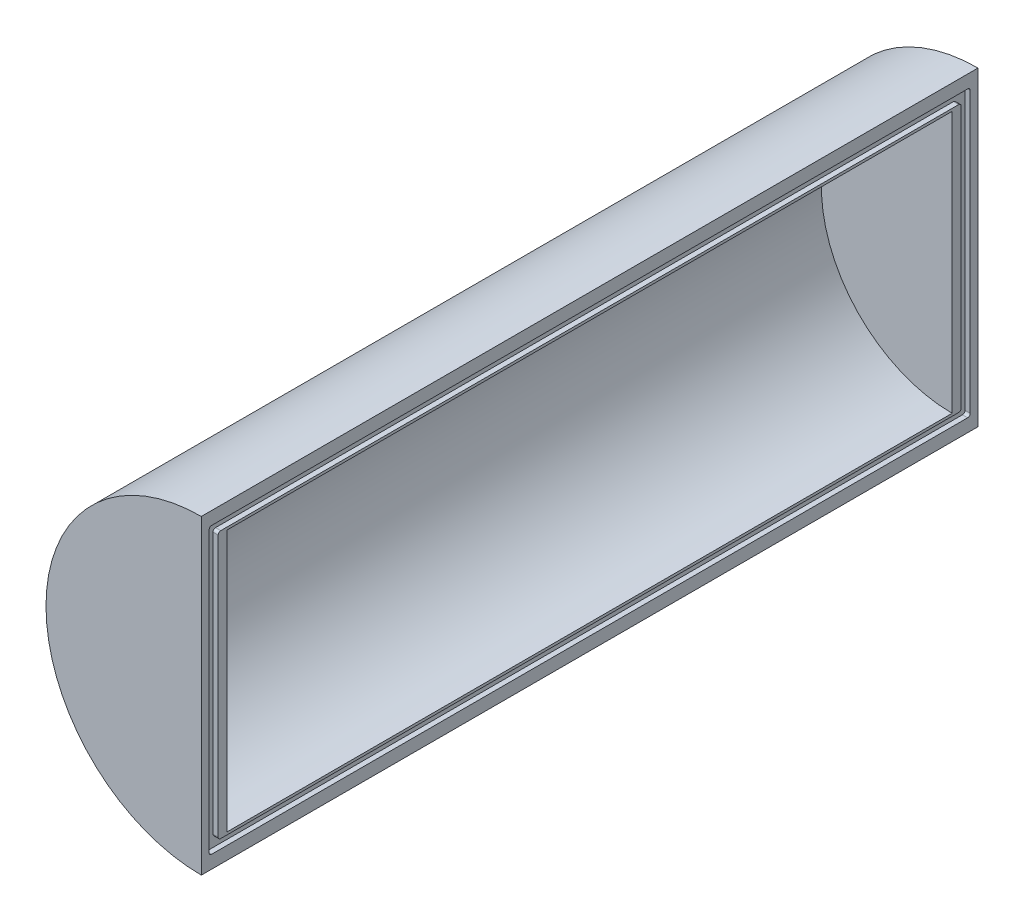
ISO-10303-21;
HEADER;
FILE_DESCRIPTION(('STEP AP214'),'2;1');
FILE_NAME('part.step','',(''),(''),'','','');
FILE_SCHEMA(('AUTOMOTIVE_DESIGN { 1 0 10303 214 1 1 1 1 }'));
ENDSEC;
DATA;
#1=APPLICATION_CONTEXT('core data for automotive mechanical design processes');
#2=APPLICATION_PROTOCOL_DEFINITION('international standard','automotive_design',2000,#1);
#3=PRODUCT_CONTEXT('',#1,'mechanical');
#4=PRODUCT('Part','Part','',(#3));
#5=PRODUCT_RELATED_PRODUCT_CATEGORY('part','',(#4));
#6=PRODUCT_DEFINITION_FORMATION('','',#4);
#7=PRODUCT_DEFINITION_CONTEXT('part definition',#1,'design');
#8=PRODUCT_DEFINITION('design','',#6,#7);
#9=PRODUCT_DEFINITION_SHAPE('','',#8);
#10=(LENGTH_UNIT() NAMED_UNIT(*) SI_UNIT(.MILLI.,.METRE.));
#11=(NAMED_UNIT(*) PLANE_ANGLE_UNIT() SI_UNIT($,.RADIAN.));
#12=(NAMED_UNIT(*) SI_UNIT($,.STERADIAN.) SOLID_ANGLE_UNIT());
#13=UNCERTAINTY_MEASURE_WITH_UNIT(LENGTH_MEASURE(1.E-05),#10,'distance_accuracy_value','');
#14=(GEOMETRIC_REPRESENTATION_CONTEXT(3) GLOBAL_UNCERTAINTY_ASSIGNED_CONTEXT((#13)) GLOBAL_UNIT_ASSIGNED_CONTEXT((#10,
#11,#12)) REPRESENTATION_CONTEXT('',''));
#15=CARTESIAN_POINT('',(0.,0.,0.));
#16=DIRECTION('',(0.,0.,1.));
#17=DIRECTION('',(1.,0.,0.));
#18=AXIS2_PLACEMENT_3D('',#15,#16,#17);
#19=CARTESIAN_POINT('',(0.,60.,-280.));
#20=DIRECTION('',(-1.,0.,0.));
#21=DIRECTION('',(0.,-1.,0.));
#22=AXIS2_PLACEMENT_3D('',#19,#20,#21);
#23=PLANE('',#22);
#24=DIRECTION('',(0.,1.,0.));
#25=VECTOR('',#24,1.);
#26=CARTESIAN_POINT('',(0.,60.,-290.));
#27=LINE('',#26,#25);
#28=CARTESIAN_POINT('',(0.,-60.,-290.));
#29=VERTEX_POINT('',#28);
#30=CARTESIAN_POINT('',(0.,60.,-290.));
#31=VERTEX_POINT('',#30);
#32=EDGE_CURVE('E302',#29,#31,#27,.T.);
#33=ORIENTED_EDGE('',*,*,#32,.T.);
#34=DIRECTION('',(0.,0.,1.));
#35=VECTOR('',#34,1.);
#36=CARTESIAN_POINT('',(0.,60.,-280.));
#37=LINE('',#36,#35);
#38=CARTESIAN_POINT('',(0.,60.,10.));
#39=VERTEX_POINT('',#38);
#40=EDGE_CURVE('E285',#31,#39,#37,.T.);
#41=ORIENTED_EDGE('',*,*,#40,.T.);
#42=DIRECTION('',(0.,1.,0.));
#43=VECTOR('',#42,1.);
#44=CARTESIAN_POINT('',(0.,60.,10.));
#45=LINE('',#44,#43);
#46=CARTESIAN_POINT('',(0.,-60.,10.));
#47=VERTEX_POINT('',#46);
#48=EDGE_CURVE('E321',#47,#39,#45,.T.);
#49=ORIENTED_EDGE('',*,*,#48,.F.);
#50=DIRECTION('',(0.,0.,1.));
#51=VECTOR('',#50,1.);
#52=CARTESIAN_POINT('',(0.,-60.,-280.));
#53=LINE('',#52,#51);
#54=EDGE_CURVE('E306',#29,#47,#53,.T.);
#55=ORIENTED_EDGE('',*,*,#54,.F.);
#56=EDGE_LOOP('',(#33,#41,#49,#55));
#57=FACE_BOUND('',#56,.T.);
#58=DIRECTION('',(0.,0.,1.));
#59=VECTOR('',#58,1.);
#60=CARTESIAN_POINT('',(0.,55.,-280.));
#61=LINE('',#60,#59);
#62=CARTESIAN_POINT('',(0.,55.,-286.));
#63=VERTEX_POINT('',#62);
#64=CARTESIAN_POINT('',(0.,55.,6.00000000000001));
#65=VERTEX_POINT('',#64);
#66=EDGE_CURVE('E298',#63,#65,#61,.T.);
#67=ORIENTED_EDGE('',*,*,#66,.F.);
#68=CARTESIAN_POINT('',(0.,54.,-286.));
#69=DIRECTION('',(-1.,0.,0.));
#70=DIRECTION('',(0.,-1.,0.));
#71=AXIS2_PLACEMENT_3D('',#68,#69,#70);
#72=CIRCLE('',#71,1.);
#73=CARTESIAN_POINT('',(0.,54.,-287.));
#74=VERTEX_POINT('',#73);
#75=EDGE_CURVE('E170',#63,#74,#72,.T.);
#76=ORIENTED_EDGE('',*,*,#75,.T.);
#77=DIRECTION('',(0.,1.,0.));
#78=VECTOR('',#77,1.);
#79=CARTESIAN_POINT('',(0.,51.5,-287.));
#80=LINE('',#79,#78);
#81=CARTESIAN_POINT('',(0.,-54.,-287.));
#82=VERTEX_POINT('',#81);
#83=EDGE_CURVE('E469',#74,#82,#80,.F.);
#84=ORIENTED_EDGE('',*,*,#83,.T.);
#85=CARTESIAN_POINT('',(0.,-54.,-286.));
#86=DIRECTION('',(-1.,0.,0.));
#87=DIRECTION('',(0.,-1.,0.));
#88=AXIS2_PLACEMENT_3D('',#85,#86,#87);
#89=CIRCLE('',#88,1.);
#90=CARTESIAN_POINT('',(0.,-55.,-286.));
#91=VERTEX_POINT('',#90);
#92=EDGE_CURVE('E156',#82,#91,#89,.T.);
#93=ORIENTED_EDGE('',*,*,#92,.T.);
#94=DIRECTION('',(0.,0.,1.));
#95=VECTOR('',#94,1.);
#96=CARTESIAN_POINT('',(0.,-55.,-280.));
#97=LINE('',#96,#95);
#98=CARTESIAN_POINT('',(0.,-55.,6.00000000000001));
#99=VERTEX_POINT('',#98);
#100=EDGE_CURVE('E367',#91,#99,#97,.T.);
#101=ORIENTED_EDGE('',*,*,#100,.T.);
#102=CARTESIAN_POINT('',(0.,-54.,6.00000000000001));
#103=DIRECTION('',(-1.,0.,0.));
#104=DIRECTION('',(0.,-1.,0.));
#105=AXIS2_PLACEMENT_3D('',#102,#103,#104);
#106=CIRCLE('',#105,1.);
#107=CARTESIAN_POINT('',(0.,-54.,7.));
#108=VERTEX_POINT('',#107);
#109=EDGE_CURVE('E451',#99,#108,#106,.T.);
#110=ORIENTED_EDGE('',*,*,#109,.T.);
#111=DIRECTION('',(0.,1.,0.));
#112=VECTOR('',#111,1.);
#113=CARTESIAN_POINT('',(0.,51.5,7.));
#114=LINE('',#113,#112);
#115=CARTESIAN_POINT('',(0.,54.,7.));
#116=VERTEX_POINT('',#115);
#117=EDGE_CURVE('E504',#116,#108,#114,.F.);
#118=ORIENTED_EDGE('',*,*,#117,.F.);
#119=CARTESIAN_POINT('',(0.,54.,6.));
#120=DIRECTION('',(-1.,0.,0.));
#121=DIRECTION('',(0.,-1.,0.));
#122=AXIS2_PLACEMENT_3D('',#119,#120,#121);
#123=CIRCLE('',#122,1.);
#124=EDGE_CURVE('E457',#116,#65,#123,.T.);
#125=ORIENTED_EDGE('',*,*,#124,.T.);
#126=EDGE_LOOP('',(#67,#76,#84,#93,#101,#110,#118,#125));
#127=FACE_BOUND('',#126,.T.);
#128=ADVANCED_FACE('F147',(#57,#127),#23,.F.);
#129=CARTESIAN_POINT('',(0.,0.,-280.));
#130=DIRECTION('',(0.,0.,1.));
#131=DIRECTION('',(1.,0.,0.));
#132=AXIS2_PLACEMENT_3D('',#129,#130,#131);
#133=CYLINDRICAL_SURFACE('',#132,60.);
#134=ORIENTED_EDGE('',*,*,#54,.T.);
#135=CARTESIAN_POINT('',(0.,0.,10.));
#136=DIRECTION('',(0.,0.,1.));
#137=DIRECTION('',(1.,0.,0.));
#138=AXIS2_PLACEMENT_3D('',#135,#136,#137);
#139=CIRCLE('',#138,60.);
#140=EDGE_CURVE('E291',#39,#47,#139,.T.);
#141=ORIENTED_EDGE('',*,*,#140,.F.);
#142=ORIENTED_EDGE('',*,*,#40,.F.);
#143=CARTESIAN_POINT('',(0.,0.,-290.));
#144=DIRECTION('',(0.,0.,1.));
#145=DIRECTION('',(1.,0.,0.));
#146=AXIS2_PLACEMENT_3D('',#143,#144,#145);
#147=CIRCLE('',#146,60.);
#148=EDGE_CURVE('E288',#31,#29,#147,.T.);
#149=ORIENTED_EDGE('',*,*,#148,.T.);
#150=EDGE_LOOP('',(#134,#141,#142,#149));
#151=FACE_BOUND('',#150,.T.);
#152=ADVANCED_FACE('F287',(#151),#133,.T.);
#153=DIRECTION('',(0.,-1.,0.));
#154=VECTOR('',#153,1.);
#155=CARTESIAN_POINT('',(0.,51.5,3.5));
#156=LINE('',#155,#154);
#157=CARTESIAN_POINT('',(0.,50.5,3.5));
#158=VERTEX_POINT('',#157);
#159=CARTESIAN_POINT('',(0.,-50.5,3.5));
#160=VERTEX_POINT('',#159);
#161=EDGE_CURVE('E493',#158,#160,#156,.T.);
#162=ORIENTED_EDGE('',*,*,#161,.T.);
#163=CARTESIAN_POINT('',(0.,-50.5,2.5));
#164=DIRECTION('',(-1.,0.,0.));
#165=DIRECTION('',(0.,-1.,0.));
#166=AXIS2_PLACEMENT_3D('',#163,#164,#165);
#167=CIRCLE('',#166,1.);
#168=CARTESIAN_POINT('',(0.,-51.5,2.5));
#169=VERTEX_POINT('',#168);
#170=EDGE_CURVE('E414',#160,#169,#167,.F.);
#171=ORIENTED_EDGE('',*,*,#170,.T.);
#172=DIRECTION('',(0.,0.,1.));
#173=VECTOR('',#172,1.);
#174=CARTESIAN_POINT('',(0.,-51.5,-280.));
#175=LINE('',#174,#173);
#176=CARTESIAN_POINT('',(0.,-51.5,-282.5));
#177=VERTEX_POINT('',#176);
#178=EDGE_CURVE('E355',#177,#169,#175,.T.);
#179=ORIENTED_EDGE('',*,*,#178,.F.);
#180=CARTESIAN_POINT('',(0.,-50.5,-282.5));
#181=DIRECTION('',(-1.,0.,0.));
#182=DIRECTION('',(0.,-1.,0.));
#183=AXIS2_PLACEMENT_3D('',#180,#181,#182);
#184=CIRCLE('',#183,1.);
#185=CARTESIAN_POINT('',(0.,-50.5,-283.5));
#186=VERTEX_POINT('',#185);
#187=EDGE_CURVE('E405',#177,#186,#184,.F.);
#188=ORIENTED_EDGE('',*,*,#187,.T.);
#189=DIRECTION('',(0.,-1.,0.));
#190=VECTOR('',#189,1.);
#191=CARTESIAN_POINT('',(0.,51.5,-283.5));
#192=LINE('',#191,#190);
#193=CARTESIAN_POINT('',(0.,50.5,-283.5));
#194=VERTEX_POINT('',#193);
#195=EDGE_CURVE('E488',#194,#186,#192,.T.);
#196=ORIENTED_EDGE('',*,*,#195,.F.);
#197=CARTESIAN_POINT('',(0.,50.5,-282.5));
#198=DIRECTION('',(-1.,0.,0.));
#199=DIRECTION('',(0.,-1.,0.));
#200=AXIS2_PLACEMENT_3D('',#197,#198,#199);
#201=CIRCLE('',#200,1.);
#202=CARTESIAN_POINT('',(0.,51.5,-282.5));
#203=VERTEX_POINT('',#202);
#204=EDGE_CURVE('E408',#194,#203,#201,.F.);
#205=ORIENTED_EDGE('',*,*,#204,.T.);
#206=DIRECTION('',(0.,0.,1.));
#207=VECTOR('',#206,1.);
#208=CARTESIAN_POINT('',(0.,51.5,-280.));
#209=LINE('',#208,#207);
#210=CARTESIAN_POINT('',(0.,51.5,2.5));
#211=VERTEX_POINT('',#210);
#212=EDGE_CURVE('E343',#203,#211,#209,.T.);
#213=ORIENTED_EDGE('',*,*,#212,.T.);
#214=CARTESIAN_POINT('',(0.,50.5,2.5));
#215=DIRECTION('',(-1.,0.,0.));
#216=DIRECTION('',(0.,-1.,0.));
#217=AXIS2_PLACEMENT_3D('',#214,#215,#216);
#218=CIRCLE('',#217,1.);
#219=EDGE_CURVE('E411',#211,#158,#218,.F.);
#220=ORIENTED_EDGE('',*,*,#219,.T.);
#221=EDGE_LOOP('',(#162,#171,#179,#188,#196,#205,#213,#220));
#222=FACE_BOUND('',#221,.T.);
#223=DIRECTION('',(0.,0.,1.));
#224=VECTOR('',#223,1.);
#225=CARTESIAN_POINT('',(0.,50.5,-280.));
#226=LINE('',#225,#224);
#227=CARTESIAN_POINT('',(0.,50.5,-280.));
#228=VERTEX_POINT('',#227);
#229=CARTESIAN_POINT('',(0.,50.5,0.));
#230=VERTEX_POINT('',#229);
#231=EDGE_CURVE('E347',#228,#230,#226,.T.);
#232=ORIENTED_EDGE('',*,*,#231,.F.);
#233=DIRECTION('',(0.,1.,0.));
#234=VECTOR('',#233,1.);
#235=CARTESIAN_POINT('',(0.,60.,-280.));
#236=LINE('',#235,#234);
#237=CARTESIAN_POINT('',(0.,-50.5,-280.));
#238=VERTEX_POINT('',#237);
#239=EDGE_CURVE('E304',#238,#228,#236,.T.);
#240=ORIENTED_EDGE('',*,*,#239,.F.);
#241=DIRECTION('',(0.,0.,1.));
#242=VECTOR('',#241,1.);
#243=CARTESIAN_POINT('',(0.,-50.5,-280.));
#244=LINE('',#243,#242);
#245=CARTESIAN_POINT('',(0.,-50.5,0.));
#246=VERTEX_POINT('',#245);
#247=EDGE_CURVE('E351',#238,#246,#244,.T.);
#248=ORIENTED_EDGE('',*,*,#247,.T.);
#249=DIRECTION('',(0.,1.,0.));
#250=VECTOR('',#249,1.);
#251=CARTESIAN_POINT('',(0.,60.,0.));
#252=LINE('',#251,#250);
#253=EDGE_CURVE('E308',#246,#230,#252,.T.);
#254=ORIENTED_EDGE('',*,*,#253,.T.);
#255=EDGE_LOOP('',(#232,#240,#248,#254));
#256=FACE_BOUND('',#255,.T.);
#257=ADVANCED_FACE('F542',(#222,#256),#23,.F.);
#258=CARTESIAN_POINT('',(0.,55.,-280.));
#259=DIRECTION('',(0.,1.,0.));
#260=DIRECTION('',(0.,0.,1.));
#261=AXIS2_PLACEMENT_3D('',#258,#259,#260);
#262=PLANE('',#261);
#263=ORIENTED_EDGE('',*,*,#66,.T.);
#264=DIRECTION('',(1.,0.,0.));
#265=VECTOR('',#264,1.);
#266=CARTESIAN_POINT('',(-2.,55.,6.));
#267=LINE('',#266,#265);
#268=CARTESIAN_POINT('',(-2.,55.,6.00000000000001));
#269=VERTEX_POINT('',#268);
#270=EDGE_CURVE('E428',#65,#269,#267,.F.);
#271=ORIENTED_EDGE('',*,*,#270,.T.);
#272=DIRECTION('',(0.,0.,1.));
#273=VECTOR('',#272,1.);
#274=CARTESIAN_POINT('',(-2.,55.,-280.));
#275=LINE('',#274,#273);
#276=CARTESIAN_POINT('',(-2.,55.,-286.));
#277=VERTEX_POINT('',#276);
#278=EDGE_CURVE('E335',#277,#269,#275,.T.);
#279=ORIENTED_EDGE('',*,*,#278,.F.);
#280=DIRECTION('',(1.,0.,0.));
#281=VECTOR('',#280,1.);
#282=CARTESIAN_POINT('',(0.,55.,-286.));
#283=LINE('',#282,#281);
#284=EDGE_CURVE('E424',#277,#63,#283,.T.);
#285=ORIENTED_EDGE('',*,*,#284,.T.);
#286=EDGE_LOOP('',(#263,#271,#279,#285));
#287=FACE_BOUND('',#286,.T.);
#288=ADVANCED_FACE('F525',(#287),#262,.F.);
#289=CARTESIAN_POINT('',(-2.,55.,-280.));
#290=DIRECTION('',(-1.,0.,0.));
#291=DIRECTION('',(0.,-1.,0.));
#292=AXIS2_PLACEMENT_3D('',#289,#290,#291);
#293=PLANE('',#292);
#294=DIRECTION('',(0.,0.,1.));
#295=VECTOR('',#294,1.);
#296=CARTESIAN_POINT('',(-2.,51.5,-280.));
#297=LINE('',#296,#295);
#298=CARTESIAN_POINT('',(-2.,51.5,-282.5));
#299=VERTEX_POINT('',#298);
#300=CARTESIAN_POINT('',(-2.,51.5,2.5));
#301=VERTEX_POINT('',#300);
#302=EDGE_CURVE('E339',#299,#301,#297,.T.);
#303=ORIENTED_EDGE('',*,*,#302,.F.);
#304=CARTESIAN_POINT('',(-2.,50.5,-282.5));
#305=DIRECTION('',(-1.,0.,0.));
#306=DIRECTION('',(0.,-1.,0.));
#307=AXIS2_PLACEMENT_3D('',#304,#305,#306);
#308=CIRCLE('',#307,1.);
#309=CARTESIAN_POINT('',(-2.,50.5,-283.5));
#310=VERTEX_POINT('',#309);
#311=EDGE_CURVE('E463',#299,#310,#308,.T.);
#312=ORIENTED_EDGE('',*,*,#311,.T.);
#313=DIRECTION('',(0.,-1.,0.));
#314=VECTOR('',#313,1.);
#315=CARTESIAN_POINT('',(-2.,51.5,-283.5));
#316=LINE('',#315,#314);
#317=CARTESIAN_POINT('',(-2.,-50.5,-283.5));
#318=VERTEX_POINT('',#317);
#319=EDGE_CURVE('E487',#310,#318,#316,.T.);
#320=ORIENTED_EDGE('',*,*,#319,.T.);
#321=CARTESIAN_POINT('',(-1.99999999999999,-50.5,-282.5));
#322=DIRECTION('',(-1.,0.,0.));
#323=DIRECTION('',(0.,-1.,0.));
#324=AXIS2_PLACEMENT_3D('',#321,#322,#323);
#325=CIRCLE('',#324,1.);
#326=CARTESIAN_POINT('',(-2.,-51.5,-282.5));
#327=VERTEX_POINT('',#326);
#328=EDGE_CURVE('E12',#318,#327,#325,.T.);
#329=ORIENTED_EDGE('',*,*,#328,.T.);
#330=DIRECTION('',(0.,0.,1.));
#331=VECTOR('',#330,1.);
#332=CARTESIAN_POINT('',(-2.,-51.5,-280.));
#333=LINE('',#332,#331);
#334=CARTESIAN_POINT('',(-2.,-51.5,2.5));
#335=VERTEX_POINT('',#334);
#336=EDGE_CURVE('E359',#327,#335,#333,.T.);
#337=ORIENTED_EDGE('',*,*,#336,.T.);
#338=CARTESIAN_POINT('',(-1.99999999999999,-50.5,2.5));
#339=DIRECTION('',(-1.,0.,0.));
#340=DIRECTION('',(0.,-1.,0.));
#341=AXIS2_PLACEMENT_3D('',#338,#339,#340);
#342=CIRCLE('',#341,1.);
#343=CARTESIAN_POINT('',(-2.,-50.5,3.5));
#344=VERTEX_POINT('',#343);
#345=EDGE_CURVE('E454',#335,#344,#342,.T.);
#346=ORIENTED_EDGE('',*,*,#345,.T.);
#347=DIRECTION('',(0.,-1.,0.));
#348=VECTOR('',#347,1.);
#349=CARTESIAN_POINT('',(-2.,51.5,3.5));
#350=LINE('',#349,#348);
#351=CARTESIAN_POINT('',(-2.,50.5,3.5));
#352=VERTEX_POINT('',#351);
#353=EDGE_CURVE('E500',#352,#344,#350,.T.);
#354=ORIENTED_EDGE('',*,*,#353,.F.);
#355=CARTESIAN_POINT('',(-2.,50.5,2.5));
#356=DIRECTION('',(-1.,0.,0.));
#357=DIRECTION('',(0.,-1.,0.));
#358=AXIS2_PLACEMENT_3D('',#355,#356,#357);
#359=CIRCLE('',#358,1.);
#360=EDGE_CURVE('E460',#352,#301,#359,.T.);
#361=ORIENTED_EDGE('',*,*,#360,.T.);
#362=EDGE_LOOP('',(#303,#312,#320,#329,#337,#346,#354,#361));
#363=FACE_BOUND('',#362,.T.);
#364=DIRECTION('',(0.,1.,0.));
#365=VECTOR('',#364,1.);
#366=CARTESIAN_POINT('',(-2.,51.5,7.));
#367=LINE('',#366,#365);
#368=CARTESIAN_POINT('',(-2.,54.,7.));
#369=VERTEX_POINT('',#368);
#370=CARTESIAN_POINT('',(-2.,-54.,7.));
#371=VERTEX_POINT('',#370);
#372=EDGE_CURVE('E318',#369,#371,#367,.F.);
#373=ORIENTED_EDGE('',*,*,#372,.T.);
#374=CARTESIAN_POINT('',(-1.99999999999999,-54.,6.00000000000001));
#375=DIRECTION('',(-1.,0.,0.));
#376=DIRECTION('',(0.,-1.,0.));
#377=AXIS2_PLACEMENT_3D('',#374,#375,#376);
#378=CIRCLE('',#377,1.);
#379=CARTESIAN_POINT('',(-2.,-55.,6.00000000000001));
#380=VERTEX_POINT('',#379);
#381=EDGE_CURVE('E395',#371,#380,#378,.F.);
#382=ORIENTED_EDGE('',*,*,#381,.T.);
#383=DIRECTION('',(0.,0.,1.));
#384=VECTOR('',#383,1.);
#385=CARTESIAN_POINT('',(-2.,-55.,-280.));
#386=LINE('',#385,#384);
#387=CARTESIAN_POINT('',(-2.,-55.,-286.));
#388=VERTEX_POINT('',#387);
#389=EDGE_CURVE('E363',#388,#380,#386,.T.);
#390=ORIENTED_EDGE('',*,*,#389,.F.);
#391=CARTESIAN_POINT('',(-1.99999999999999,-54.,-286.));
#392=DIRECTION('',(-1.,0.,0.));
#393=DIRECTION('',(0.,-1.,0.));
#394=AXIS2_PLACEMENT_3D('',#391,#392,#393);
#395=CIRCLE('',#394,1.);
#396=CARTESIAN_POINT('',(-2.,-54.,-287.));
#397=VERTEX_POINT('',#396);
#398=EDGE_CURVE('E386',#388,#397,#395,.F.);
#399=ORIENTED_EDGE('',*,*,#398,.T.);
#400=DIRECTION('',(0.,1.,0.));
#401=VECTOR('',#400,1.);
#402=CARTESIAN_POINT('',(-2.,51.5,-287.));
#403=LINE('',#402,#401);
#404=CARTESIAN_POINT('',(-2.,54.,-287.));
#405=VERTEX_POINT('',#404);
#406=EDGE_CURVE('E481',#405,#397,#403,.F.);
#407=ORIENTED_EDGE('',*,*,#406,.F.);
#408=CARTESIAN_POINT('',(-2.,54.,-286.));
#409=DIRECTION('',(-1.,0.,0.));
#410=DIRECTION('',(0.,-1.,0.));
#411=AXIS2_PLACEMENT_3D('',#408,#409,#410);
#412=CIRCLE('',#411,1.);
#413=EDGE_CURVE('E389',#405,#277,#412,.F.);
#414=ORIENTED_EDGE('',*,*,#413,.T.);
#415=ORIENTED_EDGE('',*,*,#278,.T.);
#416=CARTESIAN_POINT('',(-2.,54.,6.));
#417=DIRECTION('',(-1.,0.,0.));
#418=DIRECTION('',(0.,-1.,0.));
#419=AXIS2_PLACEMENT_3D('',#416,#417,#418);
#420=CIRCLE('',#419,1.);
#421=EDGE_CURVE('E392',#269,#369,#420,.F.);
#422=ORIENTED_EDGE('',*,*,#421,.T.);
#423=EDGE_LOOP('',(#373,#382,#390,#399,#407,#414,#415,#422));
#424=FACE_BOUND('',#423,.T.);
#425=ADVANCED_FACE('F480',(#363,#424),#293,.F.);
#426=CARTESIAN_POINT('',(-2.,51.5,-280.));
#427=DIRECTION('',(0.,-1.,0.));
#428=DIRECTION('',(0.,0.,-1.));
#429=AXIS2_PLACEMENT_3D('',#426,#427,#428);
#430=PLANE('',#429);
#431=ORIENTED_EDGE('',*,*,#302,.T.);
#432=DIRECTION('',(1.,0.,0.));
#433=VECTOR('',#432,1.);
#434=CARTESIAN_POINT('',(0.,51.5,2.5));
#435=LINE('',#434,#433);
#436=EDGE_CURVE('E434',#301,#211,#435,.T.);
#437=ORIENTED_EDGE('',*,*,#436,.T.);
#438=ORIENTED_EDGE('',*,*,#212,.F.);
#439=DIRECTION('',(1.,0.,0.));
#440=VECTOR('',#439,1.);
#441=CARTESIAN_POINT('',(-2.,51.5,-282.5));
#442=LINE('',#441,#440);
#443=EDGE_CURVE('E431',#203,#299,#442,.F.);
#444=ORIENTED_EDGE('',*,*,#443,.T.);
#445=EDGE_LOOP('',(#431,#437,#438,#444));
#446=FACE_BOUND('',#445,.T.);
#447=ADVANCED_FACE('F608',(#446),#430,.F.);
#448=CARTESIAN_POINT('',(0.,0.,-280.));
#449=DIRECTION('',(0.,0.,1.));
#450=DIRECTION('',(1.,0.,0.));
#451=AXIS2_PLACEMENT_3D('',#448,#449,#450);
#452=CYLINDRICAL_SURFACE('',#451,50.5);
#453=CARTESIAN_POINT('',(0.,0.,0.));
#454=DIRECTION('',(0.,0.,1.));
#455=DIRECTION('',(1.,0.,0.));
#456=AXIS2_PLACEMENT_3D('',#453,#454,#455);
#457=CIRCLE('',#456,50.5);
#458=EDGE_CURVE('E323',#230,#246,#457,.T.);
#459=ORIENTED_EDGE('',*,*,#458,.T.);
#460=ORIENTED_EDGE('',*,*,#247,.F.);
#461=CARTESIAN_POINT('',(0.,0.,-280.));
#462=DIRECTION('',(0.,0.,1.));
#463=DIRECTION('',(1.,0.,0.));
#464=AXIS2_PLACEMENT_3D('',#461,#462,#463);
#465=CIRCLE('',#464,50.5);
#466=EDGE_CURVE('E325',#228,#238,#465,.T.);
#467=ORIENTED_EDGE('',*,*,#466,.F.);
#468=ORIENTED_EDGE('',*,*,#231,.T.);
#469=EDGE_LOOP('',(#459,#460,#467,#468));
#470=FACE_BOUND('',#469,.T.);
#471=ADVANCED_FACE('F559',(#470),#452,.F.);
#472=CARTESIAN_POINT('',(0.,-51.5,-280.));
#473=DIRECTION('',(0.,1.,0.));
#474=DIRECTION('',(0.,0.,1.));
#475=AXIS2_PLACEMENT_3D('',#472,#473,#474);
#476=PLANE('',#475);
#477=ORIENTED_EDGE('',*,*,#178,.T.);
#478=DIRECTION('',(1.,0.,0.));
#479=VECTOR('',#478,1.);
#480=CARTESIAN_POINT('',(-2.,-51.5,2.5));
#481=LINE('',#480,#479);
#482=EDGE_CURVE('E421',#169,#335,#481,.F.);
#483=ORIENTED_EDGE('',*,*,#482,.T.);
#484=ORIENTED_EDGE('',*,*,#336,.F.);
#485=DIRECTION('',(1.,0.,0.));
#486=VECTOR('',#485,1.);
#487=CARTESIAN_POINT('',(0.,-51.5,-282.5));
#488=LINE('',#487,#486);
#489=EDGE_CURVE('E417',#327,#177,#488,.T.);
#490=ORIENTED_EDGE('',*,*,#489,.T.);
#491=EDGE_LOOP('',(#477,#483,#484,#490));
#492=FACE_BOUND('',#491,.T.);
#493=ADVANCED_FACE('F579',(#492),#476,.F.);
#494=CARTESIAN_POINT('',(-2.,-55.,-280.));
#495=DIRECTION('',(0.,-1.,0.));
#496=DIRECTION('',(0.,0.,-1.));
#497=AXIS2_PLACEMENT_3D('',#494,#495,#496);
#498=PLANE('',#497);
#499=ORIENTED_EDGE('',*,*,#389,.T.);
#500=DIRECTION('',(1.,0.,0.));
#501=VECTOR('',#500,1.);
#502=CARTESIAN_POINT('',(0.,-55.,6.00000000000001));
#503=LINE('',#502,#501);
#504=EDGE_CURVE('E375',#380,#99,#503,.T.);
#505=ORIENTED_EDGE('',*,*,#504,.T.);
#506=ORIENTED_EDGE('',*,*,#100,.F.);
#507=DIRECTION('',(1.,0.,0.));
#508=VECTOR('',#507,1.);
#509=CARTESIAN_POINT('',(-2.,-55.,-286.));
#510=LINE('',#509,#508);
#511=EDGE_CURVE('E297',#91,#388,#510,.F.);
#512=ORIENTED_EDGE('',*,*,#511,.T.);
#513=EDGE_LOOP('',(#499,#505,#506,#512));
#514=FACE_BOUND('',#513,.T.);
#515=ADVANCED_FACE('F471',(#514),#498,.F.);
#516=CARTESIAN_POINT('',(0.,0.,0.));
#517=DIRECTION('',(0.,0.,1.));
#518=DIRECTION('',(1.,0.,0.));
#519=AXIS2_PLACEMENT_3D('',#516,#517,#518);
#520=PLANE('',#519);
#521=ORIENTED_EDGE('',*,*,#458,.F.);
#522=ORIENTED_EDGE('',*,*,#253,.F.);
#523=EDGE_LOOP('',(#521,#522));
#524=FACE_BOUND('',#523,.T.);
#525=ADVANCED_FACE('F570',(#524),#520,.F.);
#526=CARTESIAN_POINT('',(0.,0.,10.));
#527=DIRECTION('',(0.,0.,1.));
#528=DIRECTION('',(1.,0.,0.));
#529=AXIS2_PLACEMENT_3D('',#526,#527,#528);
#530=PLANE('',#529);
#531=ORIENTED_EDGE('',*,*,#140,.T.);
#532=ORIENTED_EDGE('',*,*,#48,.T.);
#533=EDGE_LOOP('',(#531,#532));
#534=FACE_BOUND('',#533,.T.);
#535=ADVANCED_FACE('F563',(#534),#530,.T.);
#536=CARTESIAN_POINT('',(0.,0.,-280.));
#537=DIRECTION('',(0.,0.,-1.));
#538=DIRECTION('',(1.,0.,0.));
#539=AXIS2_PLACEMENT_3D('',#536,#537,#538);
#540=PLANE('',#539);
#541=ORIENTED_EDGE('',*,*,#239,.T.);
#542=ORIENTED_EDGE('',*,*,#466,.T.);
#543=EDGE_LOOP('',(#541,#542));
#544=FACE_BOUND('',#543,.T.);
#545=ADVANCED_FACE('F561',(#544),#540,.F.);
#546=CARTESIAN_POINT('',(0.,0.,-290.));
#547=DIRECTION('',(0.,0.,-1.));
#548=DIRECTION('',(1.,0.,0.));
#549=AXIS2_PLACEMENT_3D('',#546,#547,#548);
#550=PLANE('',#549);
#551=ORIENTED_EDGE('',*,*,#148,.F.);
#552=ORIENTED_EDGE('',*,*,#32,.F.);
#553=EDGE_LOOP('',(#551,#552));
#554=FACE_BOUND('',#553,.T.);
#555=ADVANCED_FACE('F301',(#554),#550,.T.);
#556=CARTESIAN_POINT('',(-2.,51.5,7.));
#557=DIRECTION('',(0.,0.,1.));
#558=DIRECTION('',(1.,0.,0.));
#559=AXIS2_PLACEMENT_3D('',#556,#557,#558);
#560=PLANE('',#559);
#561=ORIENTED_EDGE('',*,*,#117,.T.);
#562=DIRECTION('',(1.,0.,0.));
#563=VECTOR('',#562,1.);
#564=CARTESIAN_POINT('',(-2.,-54.,7.));
#565=LINE('',#564,#563);
#566=EDGE_CURVE('E383',#108,#371,#565,.F.);
#567=ORIENTED_EDGE('',*,*,#566,.T.);
#568=ORIENTED_EDGE('',*,*,#372,.F.);
#569=DIRECTION('',(1.,0.,0.));
#570=VECTOR('',#569,1.);
#571=CARTESIAN_POINT('',(0.,54.,7.));
#572=LINE('',#571,#570);
#573=EDGE_CURVE('E379',#369,#116,#572,.T.);
#574=ORIENTED_EDGE('',*,*,#573,.T.);
#575=EDGE_LOOP('',(#561,#567,#568,#574));
#576=FACE_BOUND('',#575,.T.);
#577=ADVANCED_FACE('F514',(#576),#560,.F.);
#578=CARTESIAN_POINT('',(-2.,51.5,3.5));
#579=DIRECTION('',(0.,0.,1.));
#580=DIRECTION('',(1.,0.,0.));
#581=AXIS2_PLACEMENT_3D('',#578,#579,#580);
#582=PLANE('',#581);
#583=ORIENTED_EDGE('',*,*,#353,.T.);
#584=DIRECTION('',(1.,0.,0.));
#585=VECTOR('',#584,1.);
#586=CARTESIAN_POINT('',(0.,-50.5,3.5));
#587=LINE('',#586,#585);
#588=EDGE_CURVE('E401',#344,#160,#587,.T.);
#589=ORIENTED_EDGE('',*,*,#588,.T.);
#590=ORIENTED_EDGE('',*,*,#161,.F.);
#591=DIRECTION('',(1.,0.,0.));
#592=VECTOR('',#591,1.);
#593=CARTESIAN_POINT('',(-2.,50.5,3.5));
#594=LINE('',#593,#592);
#595=EDGE_CURVE('E398',#158,#352,#594,.F.);
#596=ORIENTED_EDGE('',*,*,#595,.T.);
#597=EDGE_LOOP('',(#583,#589,#590,#596));
#598=FACE_BOUND('',#597,.T.);
#599=ADVANCED_FACE('F626',(#598),#582,.T.);
#600=CARTESIAN_POINT('',(-2.,51.5,-283.5));
#601=DIRECTION('',(0.,0.,1.));
#602=DIRECTION('',(1.,0.,0.));
#603=AXIS2_PLACEMENT_3D('',#600,#601,#602);
#604=PLANE('',#603);
#605=ORIENTED_EDGE('',*,*,#319,.F.);
#606=DIRECTION('',(1.,0.,0.));
#607=VECTOR('',#606,1.);
#608=CARTESIAN_POINT('',(-2.,50.5,-283.5));
#609=LINE('',#608,#607);
#610=EDGE_CURVE('E441',#310,#194,#609,.T.);
#611=ORIENTED_EDGE('',*,*,#610,.T.);
#612=ORIENTED_EDGE('',*,*,#195,.T.);
#613=DIRECTION('',(1.,0.,0.));
#614=VECTOR('',#613,1.);
#615=CARTESIAN_POINT('',(-2.,-50.5,-283.5));
#616=LINE('',#615,#614);
#617=EDGE_CURVE('E438',#186,#318,#616,.F.);
#618=ORIENTED_EDGE('',*,*,#617,.T.);
#619=EDGE_LOOP('',(#605,#611,#612,#618));
#620=FACE_BOUND('',#619,.T.);
#621=ADVANCED_FACE('F615',(#620),#604,.F.);
#622=CARTESIAN_POINT('',(-2.,51.5,-287.));
#623=DIRECTION('',(0.,0.,1.));
#624=DIRECTION('',(1.,0.,0.));
#625=AXIS2_PLACEMENT_3D('',#622,#623,#624);
#626=PLANE('',#625);
#627=ORIENTED_EDGE('',*,*,#83,.F.);
#628=DIRECTION('',(1.,0.,0.));
#629=VECTOR('',#628,1.);
#630=CARTESIAN_POINT('',(-2.,54.,-287.));
#631=LINE('',#630,#629);
#632=EDGE_CURVE('E448',#74,#405,#631,.F.);
#633=ORIENTED_EDGE('',*,*,#632,.T.);
#634=ORIENTED_EDGE('',*,*,#406,.T.);
#635=DIRECTION('',(1.,0.,0.));
#636=VECTOR('',#635,1.);
#637=CARTESIAN_POINT('',(-2.,-54.,-287.));
#638=LINE('',#637,#636);
#639=EDGE_CURVE('E445',#397,#82,#638,.T.);
#640=ORIENTED_EDGE('',*,*,#639,.T.);
#641=EDGE_LOOP('',(#627,#633,#634,#640));
#642=FACE_BOUND('',#641,.T.);
#643=ADVANCED_FACE('F484',(#642),#626,.T.);
#644=CARTESIAN_POINT('',(-2.,-54.,6.00000000000001));
#645=DIRECTION('',(-1.,0.,0.));
#646=DIRECTION('',(0.,0.,1.));
#647=AXIS2_PLACEMENT_3D('',#644,#645,#646);
#648=CYLINDRICAL_SURFACE('',#647,1.);
#649=ORIENTED_EDGE('',*,*,#381,.F.);
#650=ORIENTED_EDGE('',*,*,#566,.F.);
#651=ORIENTED_EDGE('',*,*,#109,.F.);
#652=ORIENTED_EDGE('',*,*,#504,.F.);
#653=EDGE_LOOP('',(#649,#650,#651,#652));
#654=FACE_BOUND('',#653,.T.);
#655=ADVANCED_FACE('F519',(#654),#648,.F.);
#656=CARTESIAN_POINT('',(-2.,-50.5,2.5));
#657=DIRECTION('',(-1.,0.,0.));
#658=DIRECTION('',(0.,0.,1.));
#659=AXIS2_PLACEMENT_3D('',#656,#657,#658);
#660=CYLINDRICAL_SURFACE('',#659,1.);
#661=ORIENTED_EDGE('',*,*,#345,.F.);
#662=ORIENTED_EDGE('',*,*,#482,.F.);
#663=ORIENTED_EDGE('',*,*,#170,.F.);
#664=ORIENTED_EDGE('',*,*,#588,.F.);
#665=EDGE_LOOP('',(#661,#662,#663,#664));
#666=FACE_BOUND('',#665,.T.);
#667=ADVANCED_FACE('F590',(#666),#660,.T.);
#668=CARTESIAN_POINT('',(-2.,54.,6.));
#669=DIRECTION('',(-1.,0.,0.));
#670=DIRECTION('',(0.,0.,1.));
#671=AXIS2_PLACEMENT_3D('',#668,#669,#670);
#672=CYLINDRICAL_SURFACE('',#671,1.);
#673=ORIENTED_EDGE('',*,*,#421,.F.);
#674=ORIENTED_EDGE('',*,*,#270,.F.);
#675=ORIENTED_EDGE('',*,*,#124,.F.);
#676=ORIENTED_EDGE('',*,*,#573,.F.);
#677=EDGE_LOOP('',(#673,#674,#675,#676));
#678=FACE_BOUND('',#677,.T.);
#679=ADVANCED_FACE('F522',(#678),#672,.F.);
#680=CARTESIAN_POINT('',(-2.,50.5,2.5));
#681=DIRECTION('',(-1.,0.,0.));
#682=DIRECTION('',(0.,0.,1.));
#683=AXIS2_PLACEMENT_3D('',#680,#681,#682);
#684=CYLINDRICAL_SURFACE('',#683,1.);
#685=ORIENTED_EDGE('',*,*,#360,.F.);
#686=ORIENTED_EDGE('',*,*,#595,.F.);
#687=ORIENTED_EDGE('',*,*,#219,.F.);
#688=ORIENTED_EDGE('',*,*,#436,.F.);
#689=EDGE_LOOP('',(#685,#686,#687,#688));
#690=FACE_BOUND('',#689,.T.);
#691=ADVANCED_FACE('F537',(#690),#684,.T.);
#692=CARTESIAN_POINT('',(-2.,50.5,-282.5));
#693=DIRECTION('',(1.,0.,0.));
#694=DIRECTION('',(0.,0.,-1.));
#695=AXIS2_PLACEMENT_3D('',#692,#693,#694);
#696=CYLINDRICAL_SURFACE('',#695,1.);
#697=ORIENTED_EDGE('',*,*,#311,.F.);
#698=ORIENTED_EDGE('',*,*,#443,.F.);
#699=ORIENTED_EDGE('',*,*,#204,.F.);
#700=ORIENTED_EDGE('',*,*,#610,.F.);
#701=EDGE_LOOP('',(#697,#698,#699,#700));
#702=FACE_BOUND('',#701,.T.);
#703=ADVANCED_FACE('F531',(#702),#696,.T.);
#704=CARTESIAN_POINT('',(0.,54.,-286.));
#705=DIRECTION('',(1.,0.,0.));
#706=DIRECTION('',(0.,0.,-1.));
#707=AXIS2_PLACEMENT_3D('',#704,#705,#706);
#708=CYLINDRICAL_SURFACE('',#707,1.);
#709=ORIENTED_EDGE('',*,*,#413,.F.);
#710=ORIENTED_EDGE('',*,*,#632,.F.);
#711=ORIENTED_EDGE('',*,*,#75,.F.);
#712=ORIENTED_EDGE('',*,*,#284,.F.);
#713=EDGE_LOOP('',(#709,#710,#711,#712));
#714=FACE_BOUND('',#713,.T.);
#715=ADVANCED_FACE('F529',(#714),#708,.F.);
#716=CARTESIAN_POINT('',(-2.,-54.,-286.));
#717=DIRECTION('',(1.,0.,0.));
#718=DIRECTION('',(0.,0.,-1.));
#719=AXIS2_PLACEMENT_3D('',#716,#717,#718);
#720=CYLINDRICAL_SURFACE('',#719,1.);
#721=ORIENTED_EDGE('',*,*,#398,.F.);
#722=ORIENTED_EDGE('',*,*,#511,.F.);
#723=ORIENTED_EDGE('',*,*,#92,.F.);
#724=ORIENTED_EDGE('',*,*,#639,.F.);
#725=EDGE_LOOP('',(#721,#722,#723,#724));
#726=FACE_BOUND('',#725,.T.);
#727=ADVANCED_FACE('F475',(#726),#720,.F.);
#728=CARTESIAN_POINT('',(0.,-50.5,-282.5));
#729=DIRECTION('',(1.,0.,0.));
#730=DIRECTION('',(0.,0.,-1.));
#731=AXIS2_PLACEMENT_3D('',#728,#729,#730);
#732=CYLINDRICAL_SURFACE('',#731,1.);
#733=ORIENTED_EDGE('',*,*,#328,.F.);
#734=ORIENTED_EDGE('',*,*,#617,.F.);
#735=ORIENTED_EDGE('',*,*,#187,.F.);
#736=ORIENTED_EDGE('',*,*,#489,.F.);
#737=EDGE_LOOP('',(#733,#734,#735,#736));
#738=FACE_BOUND('',#737,.T.);
#739=ADVANCED_FACE('F149',(#738),#732,.T.);
#740=CLOSED_SHELL('',(#128,#152,#257,#288,#425,#447,#471,#493,#515,#525,#535,#545,#555,#577,
#599,#621,#643,#655,#667,#679,#691,#703,#715,#727,#739));
#741=MANIFOLD_SOLID_BREP('B2',#740);
#742=ADVANCED_BREP_SHAPE_REPRESENTATION('',(#18,#741),#14);
#743=SHAPE_DEFINITION_REPRESENTATION(#9,#742);
ENDSEC;
END-ISO-10303-21;
